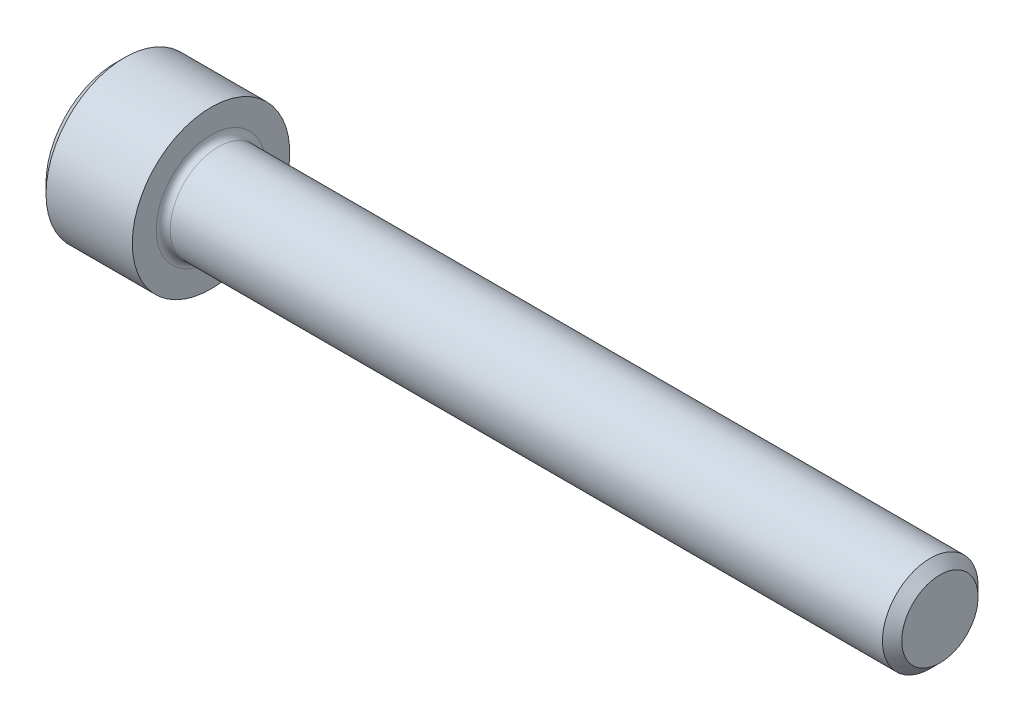
ISO-10303-21;
HEADER;
FILE_DESCRIPTION(('STEP AP214'),'2;1');
FILE_NAME('part.step','',(''),(''),'','','');
FILE_SCHEMA(('AUTOMOTIVE_DESIGN { 1 0 10303 214 1 1 1 1 }'));
ENDSEC;
DATA;
#1=APPLICATION_CONTEXT('core data for automotive mechanical design processes');
#2=APPLICATION_PROTOCOL_DEFINITION('international standard','automotive_design',2000,#1);
#3=PRODUCT_CONTEXT('',#1,'mechanical');
#4=PRODUCT('Part','Part','',(#3));
#5=PRODUCT_RELATED_PRODUCT_CATEGORY('part','',(#4));
#6=PRODUCT_DEFINITION_FORMATION('','',#4);
#7=PRODUCT_DEFINITION_CONTEXT('part definition',#1,'design');
#8=PRODUCT_DEFINITION('design','',#6,#7);
#9=PRODUCT_DEFINITION_SHAPE('','',#8);
#10=(LENGTH_UNIT() NAMED_UNIT(*) SI_UNIT(.MILLI.,.METRE.));
#11=(NAMED_UNIT(*) PLANE_ANGLE_UNIT() SI_UNIT($,.RADIAN.));
#12=(NAMED_UNIT(*) SI_UNIT($,.STERADIAN.) SOLID_ANGLE_UNIT());
#13=UNCERTAINTY_MEASURE_WITH_UNIT(LENGTH_MEASURE(1.E-05),#10,'distance_accuracy_value','');
#14=(GEOMETRIC_REPRESENTATION_CONTEXT(3) GLOBAL_UNCERTAINTY_ASSIGNED_CONTEXT((#13)) GLOBAL_UNIT_ASSIGNED_CONTEXT((#10,
#11,#12)) REPRESENTATION_CONTEXT('',''));
#15=CARTESIAN_POINT('',(0.,0.,0.));
#16=DIRECTION('',(0.,0.,1.));
#17=DIRECTION('',(1.,0.,0.));
#18=AXIS2_PLACEMENT_3D('',#15,#16,#17);
#19=CARTESIAN_POINT('',(0.,0.,0.));
#20=DIRECTION('',(-1.,0.,0.));
#21=DIRECTION('',(0.,0.,1.));
#22=AXIS2_PLACEMENT_3D('',#19,#20,#21);
#23=PLANE('',#22);
#24=DIRECTION('',(0.,-0.499999999999999,0.866025403784439));
#25=VECTOR('',#24,1.);
#26=CARTESIAN_POINT('',(0.,2.05305755723831,0.));
#27=LINE('',#26,#25);
#28=CARTESIAN_POINT('',(0.,2.05305755723831,0.));
#29=VERTEX_POINT('',#28);
#30=CARTESIAN_POINT('',(0.,1.02652877861916,1.778));
#31=VERTEX_POINT('',#30);
#32=EDGE_CURVE('E395',#29,#31,#27,.T.);
#33=ORIENTED_EDGE('',*,*,#32,.T.);
#34=DIRECTION('',(0.,1.,0.));
#35=VECTOR('',#34,1.);
#36=CARTESIAN_POINT('',(0.,-1.02652877861915,1.778));
#37=LINE('',#36,#35);
#38=CARTESIAN_POINT('',(0.,-1.02652877861915,1.778));
#39=VERTEX_POINT('',#38);
#40=EDGE_CURVE('E141',#39,#31,#37,.T.);
#41=ORIENTED_EDGE('',*,*,#40,.F.);
#42=DIRECTION('',(0.,-0.500000000000001,-0.866025403784438));
#43=VECTOR('',#42,1.);
#44=CARTESIAN_POINT('',(0.,-1.02652877861915,1.778));
#45=LINE('',#44,#43);
#46=CARTESIAN_POINT('',(0.,-2.0530575572383,0.));
#47=VERTEX_POINT('',#46);
#48=EDGE_CURVE('E398',#39,#47,#45,.T.);
#49=ORIENTED_EDGE('',*,*,#48,.T.);
#50=DIRECTION('',(0.,0.499999999999998,-0.86602540378444));
#51=VECTOR('',#50,1.);
#52=CARTESIAN_POINT('',(0.,-2.0530575572383,0.));
#53=LINE('',#52,#51);
#54=CARTESIAN_POINT('',(0.,-1.02652877861915,-1.778));
#55=VERTEX_POINT('',#54);
#56=EDGE_CURVE('E401',#47,#55,#53,.T.);
#57=ORIENTED_EDGE('',*,*,#56,.T.);
#58=DIRECTION('',(0.,-1.,0.));
#59=VECTOR('',#58,1.);
#60=CARTESIAN_POINT('',(0.,1.02652877861916,-1.778));
#61=LINE('',#60,#59);
#62=CARTESIAN_POINT('',(0.,1.02652877861916,-1.778));
#63=VERTEX_POINT('',#62);
#64=EDGE_CURVE('E404',#63,#55,#61,.T.);
#65=ORIENTED_EDGE('',*,*,#64,.F.);
#66=DIRECTION('',(0.,-0.500000000000001,-0.866025403784438));
#67=VECTOR('',#66,1.);
#68=CARTESIAN_POINT('',(0.,2.05305755723831,0.));
#69=LINE('',#68,#67);
#70=EDGE_CURVE('E136',#29,#63,#69,.T.);
#71=ORIENTED_EDGE('',*,*,#70,.F.);
#72=EDGE_LOOP('',(#33,#41,#49,#57,#65,#71));
#73=FACE_BOUND('',#72,.T.);
#74=CARTESIAN_POINT('',(0.,0.,0.));
#75=DIRECTION('',(-1.,0.,0.));
#76=DIRECTION('',(0.,0.,1.));
#77=AXIS2_PLACEMENT_3D('',#74,#75,#76);
#78=CIRCLE('',#77,3.0226);
#79=CARTESIAN_POINT('',(0.,0.,3.0226));
#80=VERTEX_POINT('',#79);
#81=EDGE_CURVE('E154',#80,#80,#78,.T.);
#82=ORIENTED_EDGE('',*,*,#81,.T.);
#83=EDGE_LOOP('',(#82));
#84=FACE_BOUND('',#83,.T.);
#85=ADVANCED_FACE('F36',(#73,#84),#23,.T.);
#86=CARTESIAN_POINT('',(35.9156,1.66243,0.));
#87=DIRECTION('',(1.,0.,0.));
#88=DIRECTION('',(0.,0.,-1.));
#89=AXIS2_PLACEMENT_3D('',#86,#87,#88);
#90=PLANE('',#89);
#91=CARTESIAN_POINT('',(35.9156,0.,0.));
#92=DIRECTION('',(-1.,0.,0.));
#93=DIRECTION('',(0.,0.,1.));
#94=AXIS2_PLACEMENT_3D('',#91,#92,#93);
#95=CIRCLE('',#94,1.66243);
#96=CARTESIAN_POINT('',(35.9156,0.,1.66243));
#97=VERTEX_POINT('',#96);
#98=EDGE_CURVE('E169',#97,#97,#95,.T.);
#99=ORIENTED_EDGE('',*,*,#98,.F.);
#100=EDGE_LOOP('',(#99));
#101=FACE_BOUND('',#100,.T.);
#102=ADVANCED_FACE('F193',(#101),#90,.T.);
#103=CARTESIAN_POINT('',(35.9156,0.,0.));
#104=DIRECTION('',(-1.,0.,0.));
#105=DIRECTION('',(0.,0.,1.));
#106=AXIS2_PLACEMENT_3D('',#103,#104,#105);
#107=CONICAL_SURFACE('',#106,1.66243,0.78539816339718);
#108=CARTESIAN_POINT('',(35.4952299999999,0.,0.));
#109=DIRECTION('',(-1.,0.,0.));
#110=DIRECTION('',(0.,0.,1.));
#111=AXIS2_PLACEMENT_3D('',#108,#109,#110);
#112=CIRCLE('',#111,2.08279999999989);
#113=CARTESIAN_POINT('',(35.4952299999999,0.,2.08279999999989));
#114=VERTEX_POINT('',#113);
#115=EDGE_CURVE('E166',#114,#114,#112,.T.);
#116=ORIENTED_EDGE('',*,*,#115,.F.);
#117=EDGE_LOOP('',(#116));
#118=FACE_BOUND('',#117,.T.);
#119=ORIENTED_EDGE('',*,*,#98,.T.);
#120=EDGE_LOOP('',(#119));
#121=FACE_BOUND('',#120,.T.);
#122=ADVANCED_FACE('F199',(#118,#121),#107,.T.);
#123=CARTESIAN_POINT('',(-31.75,0.,0.));
#124=DIRECTION('',(-1.,0.,0.));
#125=DIRECTION('',(0.,0.,1.));
#126=AXIS2_PLACEMENT_3D('',#123,#124,#125);
#127=CYLINDRICAL_SURFACE('',#126,2.08279999999994);
#128=CARTESIAN_POINT('',(4.4704,0.,0.));
#129=DIRECTION('',(1.,0.,0.));
#130=DIRECTION('',(0.,0.,-1.));
#131=AXIS2_PLACEMENT_3D('',#128,#129,#130);
#132=CIRCLE('',#131,2.08279999999994);
#133=CARTESIAN_POINT('',(4.4704,0.,-2.08279999999994));
#134=VERTEX_POINT('',#133);
#135=EDGE_CURVE('E11',#134,#134,#132,.T.);
#136=ORIENTED_EDGE('',*,*,#135,.T.);
#137=EDGE_LOOP('',(#136));
#138=FACE_BOUND('',#137,.T.);
#139=ORIENTED_EDGE('',*,*,#115,.T.);
#140=EDGE_LOOP('',(#139));
#141=FACE_BOUND('',#140,.T.);
#142=ADVANCED_FACE('F210',(#138,#141),#127,.T.);
#143=CARTESIAN_POINT('',(4.1656,3.429,0.));
#144=DIRECTION('',(1.,0.,0.));
#145=DIRECTION('',(0.,0.,-1.));
#146=AXIS2_PLACEMENT_3D('',#143,#144,#145);
#147=PLANE('',#146);
#148=CARTESIAN_POINT('',(4.1656,0.,0.));
#149=DIRECTION('',(1.,0.,0.));
#150=DIRECTION('',(0.,0.,-1.));
#151=AXIS2_PLACEMENT_3D('',#148,#149,#150);
#152=CIRCLE('',#151,2.38759999999994);
#153=CARTESIAN_POINT('',(4.1656,0.,-2.38759999999994));
#154=VERTEX_POINT('',#153);
#155=EDGE_CURVE('E45',#154,#154,#152,.F.);
#156=ORIENTED_EDGE('',*,*,#155,.T.);
#157=EDGE_LOOP('',(#156));
#158=FACE_BOUND('',#157,.T.);
#159=CARTESIAN_POINT('',(4.16560000000001,0.,0.));
#160=DIRECTION('',(-1.,0.,0.));
#161=DIRECTION('',(0.,0.,1.));
#162=AXIS2_PLACEMENT_3D('',#159,#160,#161);
#163=CIRCLE('',#162,3.429);
#164=CARTESIAN_POINT('',(4.16560000000001,0.,3.429));
#165=VERTEX_POINT('',#164);
#166=EDGE_CURVE('E162',#165,#165,#163,.T.);
#167=ORIENTED_EDGE('',*,*,#166,.F.);
#168=EDGE_LOOP('',(#167));
#169=FACE_BOUND('',#168,.T.);
#170=ADVANCED_FACE('F177',(#158,#169),#147,.T.);
#171=CARTESIAN_POINT('',(-31.75,0.,0.));
#172=DIRECTION('',(-1.,0.,0.));
#173=DIRECTION('',(0.,0.,1.));
#174=AXIS2_PLACEMENT_3D('',#171,#172,#173);
#175=CYLINDRICAL_SURFACE('',#174,3.429);
#176=ORIENTED_EDGE('',*,*,#166,.T.);
#177=EDGE_LOOP('',(#176));
#178=FACE_BOUND('',#177,.T.);
#179=CARTESIAN_POINT('',(0.406400000000001,0.,0.));
#180=DIRECTION('',(-1.,0.,0.));
#181=DIRECTION('',(0.,0.,1.));
#182=AXIS2_PLACEMENT_3D('',#179,#180,#181);
#183=CIRCLE('',#182,3.429);
#184=CARTESIAN_POINT('',(0.406400000000001,0.,3.429));
#185=VERTEX_POINT('',#184);
#186=EDGE_CURVE('E158',#185,#185,#183,.T.);
#187=ORIENTED_EDGE('',*,*,#186,.F.);
#188=EDGE_LOOP('',(#187));
#189=FACE_BOUND('',#188,.T.);
#190=ADVANCED_FACE('F188',(#178,#189),#175,.T.);
#191=CARTESIAN_POINT('',(0.,0.,0.));
#192=DIRECTION('',(1.,0.,0.));
#193=DIRECTION('',(0.,0.,-1.));
#194=AXIS2_PLACEMENT_3D('',#191,#192,#193);
#195=CONICAL_SURFACE('',#194,3.0226,0.785398163397446);
#196=ORIENTED_EDGE('',*,*,#186,.T.);
#197=EDGE_LOOP('',(#196));
#198=FACE_BOUND('',#197,.T.);
#199=ORIENTED_EDGE('',*,*,#81,.F.);
#200=EDGE_LOOP('',(#199));
#201=FACE_BOUND('',#200,.T.);
#202=ADVANCED_FACE('F181',(#198,#201),#195,.T.);
#203=CARTESIAN_POINT('',(4.4704,0.,0.));
#204=DIRECTION('',(1.,0.,0.));
#205=DIRECTION('',(0.,0.,-1.));
#206=AXIS2_PLACEMENT_3D('',#203,#204,#205);
#207=TOROIDAL_SURFACE('',#206,2.38759999999994,0.3048);
#208=ORIENTED_EDGE('',*,*,#135,.F.);
#209=EDGE_LOOP('',(#208));
#210=FACE_BOUND('',#209,.T.);
#211=ORIENTED_EDGE('',*,*,#155,.F.);
#212=EDGE_LOOP('',(#211));
#213=FACE_BOUND('',#212,.T.);
#214=ADVANCED_FACE('F38',(#210,#213),#207,.F.);
#215=CARTESIAN_POINT('',(1.9558,2.05305755723831,0.));
#216=DIRECTION('',(0.,-0.866025403784439,-0.499999999999999));
#217=DIRECTION('',(0.,0.499999999999999,-0.866025403784439));
#218=AXIS2_PLACEMENT_3D('',#215,#216,#217);
#219=PLANE('',#218);
#220=ORIENTED_EDGE('',*,*,#32,.F.);
#221=DIRECTION('',(-1.,0.,0.));
#222=VECTOR('',#221,1.);
#223=CARTESIAN_POINT('',(1.9558,2.05305755723831,0.));
#224=LINE('',#223,#222);
#225=CARTESIAN_POINT('',(1.9558,2.05305755723831,0.));
#226=VERTEX_POINT('',#225);
#227=EDGE_CURVE('E383',#226,#29,#224,.T.);
#228=ORIENTED_EDGE('',*,*,#227,.F.);
#229=DIRECTION('',(0.,-0.499999999999999,0.866025403784439));
#230=VECTOR('',#229,1.);
#231=CARTESIAN_POINT('',(1.9558,2.05305755723831,0.));
#232=LINE('',#231,#230);
#233=CARTESIAN_POINT('',(1.9558,1.53979316792874,0.889));
#234=VERTEX_POINT('',#233);
#235=EDGE_CURVE('E127',#226,#234,#232,.T.);
#236=ORIENTED_EDGE('',*,*,#235,.T.);
#237=CARTESIAN_POINT('',(1.9558,1.02652877861916,1.778));
#238=VERTEX_POINT('',#237);
#239=EDGE_CURVE('E117',#234,#238,#232,.T.);
#240=ORIENTED_EDGE('',*,*,#239,.T.);
#241=DIRECTION('',(-1.,0.,0.));
#242=VECTOR('',#241,1.);
#243=CARTESIAN_POINT('',(1.9558,1.02652877861916,1.778));
#244=LINE('',#243,#242);
#245=EDGE_CURVE('E132',#238,#31,#244,.T.);
#246=ORIENTED_EDGE('',*,*,#245,.T.);
#247=EDGE_LOOP('',(#220,#228,#236,#240,#246));
#248=FACE_BOUND('',#247,.T.);
#249=ADVANCED_FACE('F131',(#248),#219,.T.);
#250=CARTESIAN_POINT('',(1.9558,-1.02652877861915,1.778));
#251=DIRECTION('',(0.,0.,1.));
#252=DIRECTION('',(0.,-1.,0.));
#253=AXIS2_PLACEMENT_3D('',#250,#251,#252);
#254=PLANE('',#253);
#255=ORIENTED_EDGE('',*,*,#40,.T.);
#256=ORIENTED_EDGE('',*,*,#245,.F.);
#257=DIRECTION('',(0.,1.,0.));
#258=VECTOR('',#257,1.);
#259=CARTESIAN_POINT('',(1.9558,-1.02652877861915,1.778));
#260=LINE('',#259,#258);
#261=CARTESIAN_POINT('',(1.9558,0.,1.778));
#262=VERTEX_POINT('',#261);
#263=EDGE_CURVE('E114',#262,#238,#260,.T.);
#264=ORIENTED_EDGE('',*,*,#263,.F.);
#265=CARTESIAN_POINT('',(1.9558,-1.02652877861915,1.778));
#266=VERTEX_POINT('',#265);
#267=EDGE_CURVE('E126',#266,#262,#260,.T.);
#268=ORIENTED_EDGE('',*,*,#267,.F.);
#269=DIRECTION('',(-1.,0.,0.));
#270=VECTOR('',#269,1.);
#271=CARTESIAN_POINT('',(1.9558,-1.02652877861915,1.778));
#272=LINE('',#271,#270);
#273=EDGE_CURVE('E144',#266,#39,#272,.T.);
#274=ORIENTED_EDGE('',*,*,#273,.T.);
#275=EDGE_LOOP('',(#255,#256,#264,#268,#274));
#276=FACE_BOUND('',#275,.T.);
#277=ADVANCED_FACE('F138',(#276),#254,.F.);
#278=CARTESIAN_POINT('',(1.9558,-1.02652877861915,1.778));
#279=DIRECTION('',(0.,0.866025403784438,-0.500000000000001));
#280=DIRECTION('',(0.,0.500000000000001,0.866025403784438));
#281=AXIS2_PLACEMENT_3D('',#278,#279,#280);
#282=PLANE('',#281);
#283=ORIENTED_EDGE('',*,*,#48,.F.);
#284=ORIENTED_EDGE('',*,*,#273,.F.);
#285=DIRECTION('',(0.,-0.500000000000001,-0.866025403784438));
#286=VECTOR('',#285,1.);
#287=CARTESIAN_POINT('',(1.9558,-1.02652877861915,1.778));
#288=LINE('',#287,#286);
#289=CARTESIAN_POINT('',(1.9558,-1.53979316792873,0.888999999999999));
#290=VERTEX_POINT('',#289);
#291=EDGE_CURVE('E426',#266,#290,#288,.T.);
#292=ORIENTED_EDGE('',*,*,#291,.T.);
#293=CARTESIAN_POINT('',(1.9558,-2.0530575572383,0.));
#294=VERTEX_POINT('',#293);
#295=EDGE_CURVE('E414',#290,#294,#288,.T.);
#296=ORIENTED_EDGE('',*,*,#295,.T.);
#297=DIRECTION('',(-1.,0.,0.));
#298=VECTOR('',#297,1.);
#299=CARTESIAN_POINT('',(1.9558,-2.0530575572383,0.));
#300=LINE('',#299,#298);
#301=EDGE_CURVE('E150',#294,#47,#300,.T.);
#302=ORIENTED_EDGE('',*,*,#301,.T.);
#303=EDGE_LOOP('',(#283,#284,#292,#296,#302));
#304=FACE_BOUND('',#303,.T.);
#305=ADVANCED_FACE('F273',(#304),#282,.T.);
#306=CARTESIAN_POINT('',(1.9558,-2.0530575572383,0.));
#307=DIRECTION('',(0.,0.86602540378444,0.499999999999998));
#308=DIRECTION('',(0.,-0.499999999999998,0.86602540378444));
#309=AXIS2_PLACEMENT_3D('',#306,#307,#308);
#310=PLANE('',#309);
#311=ORIENTED_EDGE('',*,*,#56,.F.);
#312=ORIENTED_EDGE('',*,*,#301,.F.);
#313=DIRECTION('',(0.,0.499999999999998,-0.86602540378444));
#314=VECTOR('',#313,1.);
#315=CARTESIAN_POINT('',(1.9558,-2.0530575572383,0.));
#316=LINE('',#315,#314);
#317=CARTESIAN_POINT('',(1.9558,-1.53979316792873,-0.888999999999996));
#318=VERTEX_POINT('',#317);
#319=EDGE_CURVE('E390',#294,#318,#316,.T.);
#320=ORIENTED_EDGE('',*,*,#319,.T.);
#321=CARTESIAN_POINT('',(1.9558,-1.02652877861915,-1.778));
#322=VERTEX_POINT('',#321);
#323=EDGE_CURVE('E425',#318,#322,#316,.T.);
#324=ORIENTED_EDGE('',*,*,#323,.T.);
#325=DIRECTION('',(-1.,0.,0.));
#326=VECTOR('',#325,1.);
#327=CARTESIAN_POINT('',(1.9558,-1.02652877861915,-1.778));
#328=LINE('',#327,#326);
#329=EDGE_CURVE('E382',#322,#55,#328,.T.);
#330=ORIENTED_EDGE('',*,*,#329,.T.);
#331=EDGE_LOOP('',(#311,#312,#320,#324,#330));
#332=FACE_BOUND('',#331,.T.);
#333=ADVANCED_FACE('F281',(#332),#310,.T.);
#334=CARTESIAN_POINT('',(1.9558,1.02652877861916,-1.778));
#335=DIRECTION('',(0.,0.,-1.));
#336=DIRECTION('',(0.,1.,0.));
#337=AXIS2_PLACEMENT_3D('',#334,#335,#336);
#338=PLANE('',#337);
#339=ORIENTED_EDGE('',*,*,#64,.T.);
#340=ORIENTED_EDGE('',*,*,#329,.F.);
#341=DIRECTION('',(0.,-1.,0.));
#342=VECTOR('',#341,1.);
#343=CARTESIAN_POINT('',(1.9558,1.02652877861916,-1.778));
#344=LINE('',#343,#342);
#345=CARTESIAN_POINT('',(1.95580000000001,0.,-1.778));
#346=VERTEX_POINT('',#345);
#347=EDGE_CURVE('E386',#346,#322,#344,.T.);
#348=ORIENTED_EDGE('',*,*,#347,.F.);
#349=CARTESIAN_POINT('',(1.9558,1.02652877861916,-1.778));
#350=VERTEX_POINT('',#349);
#351=EDGE_CURVE('E52',#350,#346,#344,.T.);
#352=ORIENTED_EDGE('',*,*,#351,.F.);
#353=DIRECTION('',(-1.,0.,0.));
#354=VECTOR('',#353,1.);
#355=CARTESIAN_POINT('',(1.9558,1.02652877861916,-1.778));
#356=LINE('',#355,#354);
#357=EDGE_CURVE('E378',#350,#63,#356,.T.);
#358=ORIENTED_EDGE('',*,*,#357,.T.);
#359=EDGE_LOOP('',(#339,#340,#348,#352,#358));
#360=FACE_BOUND('',#359,.T.);
#361=ADVANCED_FACE('F290',(#360),#338,.F.);
#362=CARTESIAN_POINT('',(1.9558,2.05305755723831,0.));
#363=DIRECTION('',(0.,0.866025403784438,-0.500000000000001));
#364=DIRECTION('',(0.,0.500000000000001,0.866025403784438));
#365=AXIS2_PLACEMENT_3D('',#362,#363,#364);
#366=PLANE('',#365);
#367=ORIENTED_EDGE('',*,*,#70,.T.);
#368=ORIENTED_EDGE('',*,*,#357,.F.);
#369=DIRECTION('',(0.,-0.500000000000001,-0.866025403784438));
#370=VECTOR('',#369,1.);
#371=CARTESIAN_POINT('',(1.9558,2.05305755723831,0.));
#372=LINE('',#371,#370);
#373=CARTESIAN_POINT('',(1.9558,1.53979316792874,-0.889000000000004));
#374=VERTEX_POINT('',#373);
#375=EDGE_CURVE('E368',#374,#350,#372,.T.);
#376=ORIENTED_EDGE('',*,*,#375,.F.);
#377=EDGE_CURVE('E374',#226,#374,#372,.T.);
#378=ORIENTED_EDGE('',*,*,#377,.F.);
#379=ORIENTED_EDGE('',*,*,#227,.T.);
#380=EDGE_LOOP('',(#367,#368,#376,#378,#379));
#381=FACE_BOUND('',#380,.T.);
#382=ADVANCED_FACE('F299',(#381),#366,.F.);
#383=CARTESIAN_POINT('',(1.9558,3.07958633585747,-1.778));
#384=DIRECTION('',(1.,0.,0.));
#385=DIRECTION('',(0.,0.,-1.));
#386=AXIS2_PLACEMENT_3D('',#383,#384,#385);
#387=PLANE('',#386);
#388=ORIENTED_EDGE('',*,*,#347,.T.);
#389=ORIENTED_EDGE('',*,*,#323,.F.);
#390=CARTESIAN_POINT('',(1.95580000000001,0.,0.));
#391=DIRECTION('',(-1.,0.,0.));
#392=DIRECTION('',(0.,0.,1.));
#393=AXIS2_PLACEMENT_3D('',#390,#391,#392);
#394=CIRCLE('',#393,1.778);
#395=EDGE_CURVE('E421',#346,#318,#394,.T.);
#396=ORIENTED_EDGE('',*,*,#395,.F.);
#397=EDGE_LOOP('',(#388,#389,#396));
#398=FACE_BOUND('',#397,.T.);
#399=ADVANCED_FACE('F308',(#398),#387,.F.);
#400=ORIENTED_EDGE('',*,*,#319,.F.);
#401=ORIENTED_EDGE('',*,*,#295,.F.);
#402=EDGE_CURVE('E148',#318,#290,#394,.T.);
#403=ORIENTED_EDGE('',*,*,#402,.F.);
#404=EDGE_LOOP('',(#400,#401,#403));
#405=FACE_BOUND('',#404,.T.);
#406=ADVANCED_FACE('F317',(#405),#387,.F.);
#407=ORIENTED_EDGE('',*,*,#291,.F.);
#408=ORIENTED_EDGE('',*,*,#267,.T.);
#409=EDGE_CURVE('E143',#290,#262,#394,.T.);
#410=ORIENTED_EDGE('',*,*,#409,.F.);
#411=EDGE_LOOP('',(#407,#408,#410));
#412=FACE_BOUND('',#411,.T.);
#413=ADVANCED_FACE('F326',(#412),#387,.F.);
#414=ORIENTED_EDGE('',*,*,#263,.T.);
#415=ORIENTED_EDGE('',*,*,#239,.F.);
#416=EDGE_CURVE('E120',#262,#234,#394,.T.);
#417=ORIENTED_EDGE('',*,*,#416,.F.);
#418=EDGE_LOOP('',(#414,#415,#417));
#419=FACE_BOUND('',#418,.T.);
#420=ADVANCED_FACE('F116',(#419),#387,.F.);
#421=ORIENTED_EDGE('',*,*,#235,.F.);
#422=ORIENTED_EDGE('',*,*,#377,.T.);
#423=EDGE_CURVE('E155',#234,#374,#394,.T.);
#424=ORIENTED_EDGE('',*,*,#423,.F.);
#425=EDGE_LOOP('',(#421,#422,#424));
#426=FACE_BOUND('',#425,.T.);
#427=ADVANCED_FACE('F341',(#426),#387,.F.);
#428=ORIENTED_EDGE('',*,*,#375,.T.);
#429=ORIENTED_EDGE('',*,*,#351,.T.);
#430=EDGE_CURVE('E371',#374,#346,#394,.T.);
#431=ORIENTED_EDGE('',*,*,#430,.F.);
#432=EDGE_LOOP('',(#428,#429,#431));
#433=FACE_BOUND('',#432,.T.);
#434=ADVANCED_FACE('F256',(#433),#387,.F.);
#435=CARTESIAN_POINT('',(1.95580000000001,0.,0.));
#436=DIRECTION('',(-1.,0.,0.));
#437=DIRECTION('',(0.,0.,1.));
#438=AXIS2_PLACEMENT_3D('',#435,#436,#437);
#439=CONICAL_SURFACE('',#438,1.778,1.04719755119659);
#440=CARTESIAN_POINT('',(2.98232877861918,0.,0.));
#441=VERTEX_POINT('',#440);
#442=VERTEX_LOOP('',#441);
#443=FACE_BOUND('',#442,.T.);
#444=ORIENTED_EDGE('',*,*,#416,.T.);
#445=ORIENTED_EDGE('',*,*,#423,.T.);
#446=ORIENTED_EDGE('',*,*,#430,.T.);
#447=ORIENTED_EDGE('',*,*,#395,.T.);
#448=ORIENTED_EDGE('',*,*,#402,.T.);
#449=ORIENTED_EDGE('',*,*,#409,.T.);
#450=EDGE_LOOP('',(#444,#445,#446,#447,#448,#449));
#451=FACE_BOUND('',#450,.T.);
#452=ADVANCED_FACE('F203',(#443,#451),#439,.F.);
#453=CLOSED_SHELL('',(#85,#102,#122,#142,#170,#190,#202,#214,#249,#277,#305,#333,#361,#382,#399,
#406,#413,#420,#427,#434,#452));
#454=MANIFOLD_SOLID_BREP('B2',#453);
#455=ADVANCED_BREP_SHAPE_REPRESENTATION('',(#18,#454),#14);
#456=SHAPE_DEFINITION_REPRESENTATION(#9,#455);
ENDSEC;
END-ISO-10303-21;
